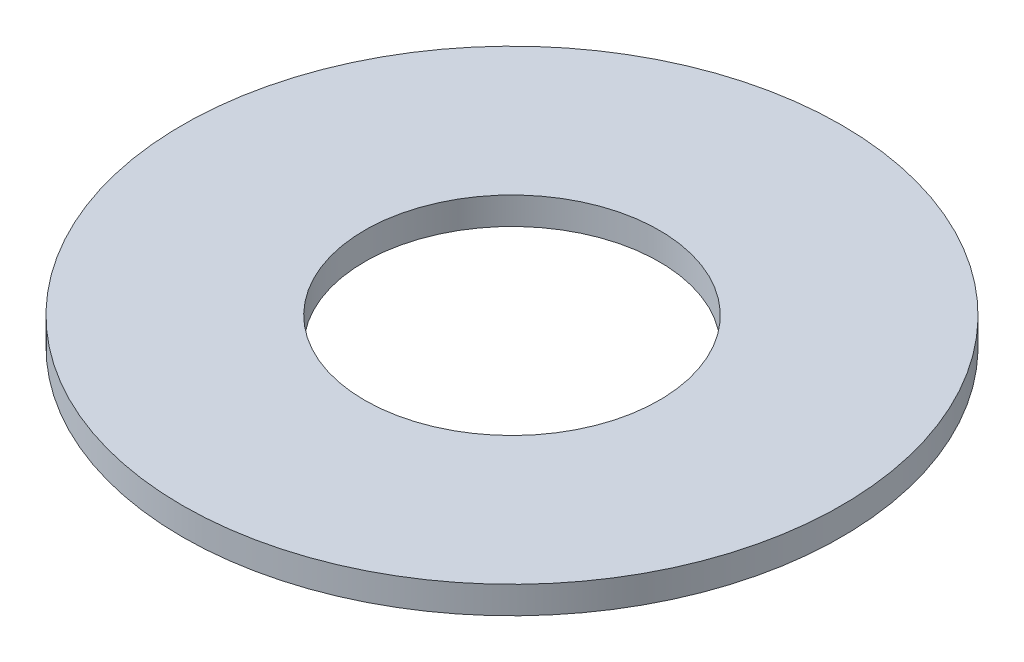
ISO-10303-21;
HEADER;
FILE_DESCRIPTION(('STEP AP214'),'2;1');
FILE_NAME('part.step','',(''),(''),'','','');
FILE_SCHEMA(('AUTOMOTIVE_DESIGN { 1 0 10303 214 1 1 1 1 }'));
ENDSEC;
DATA;
#1=APPLICATION_CONTEXT('core data for automotive mechanical design processes');
#2=APPLICATION_PROTOCOL_DEFINITION('international standard','automotive_design',2000,#1);
#3=PRODUCT_CONTEXT('',#1,'mechanical');
#4=PRODUCT('Part','Part','',(#3));
#5=PRODUCT_RELATED_PRODUCT_CATEGORY('part','',(#4));
#6=PRODUCT_DEFINITION_FORMATION('','',#4);
#7=PRODUCT_DEFINITION_CONTEXT('part definition',#1,'design');
#8=PRODUCT_DEFINITION('design','',#6,#7);
#9=PRODUCT_DEFINITION_SHAPE('','',#8);
#10=(LENGTH_UNIT() NAMED_UNIT(*) SI_UNIT(.MILLI.,.METRE.));
#11=(NAMED_UNIT(*) PLANE_ANGLE_UNIT() SI_UNIT($,.RADIAN.));
#12=(NAMED_UNIT(*) SI_UNIT($,.STERADIAN.) SOLID_ANGLE_UNIT());
#13=UNCERTAINTY_MEASURE_WITH_UNIT(LENGTH_MEASURE(1.E-05),#10,'distance_accuracy_value','');
#14=(GEOMETRIC_REPRESENTATION_CONTEXT(3) GLOBAL_UNCERTAINTY_ASSIGNED_CONTEXT((#13)) GLOBAL_UNIT_ASSIGNED_CONTEXT((#10,
#11,#12)) REPRESENTATION_CONTEXT('',''));
#15=CARTESIAN_POINT('',(0.,0.,0.));
#16=DIRECTION('',(0.,0.,1.));
#17=DIRECTION('',(1.,0.,0.));
#18=AXIS2_PLACEMENT_3D('',#15,#16,#17);
#19=CARTESIAN_POINT('',(0.,2.,0.));
#20=DIRECTION('',(0.,1.,0.));
#21=DIRECTION('',(0.,0.,1.));
#22=AXIS2_PLACEMENT_3D('',#19,#20,#21);
#23=PLANE('',#22);
#24=CARTESIAN_POINT('',(0.,2.,0.));
#25=DIRECTION('',(0.,1.,0.));
#26=DIRECTION('',(0.,0.,1.));
#27=AXIS2_PLACEMENT_3D('',#24,#25,#26);
#28=CIRCLE('',#27,24.15);
#29=CARTESIAN_POINT('',(0.,2.,24.15));
#30=VERTEX_POINT('',#29);
#31=EDGE_CURVE('E10',#30,#30,#28,.T.);
#32=ORIENTED_EDGE('',*,*,#31,.T.);
#33=EDGE_LOOP('',(#32));
#34=FACE_BOUND('',#33,.T.);
#35=CARTESIAN_POINT('',(0.,2.,0.));
#36=DIRECTION('',(0.,1.,0.));
#37=DIRECTION('',(0.,0.,1.));
#38=AXIS2_PLACEMENT_3D('',#35,#36,#37);
#39=CIRCLE('',#38,10.795);
#40=CARTESIAN_POINT('',(0.,2.,10.795));
#41=VERTEX_POINT('',#40);
#42=EDGE_CURVE('E50',#41,#41,#39,.T.);
#43=ORIENTED_EDGE('',*,*,#42,.F.);
#44=EDGE_LOOP('',(#43));
#45=FACE_BOUND('',#44,.T.);
#46=ADVANCED_FACE('F37',(#34,#45),#23,.T.);
#47=CARTESIAN_POINT('',(0.,0.,0.));
#48=DIRECTION('',(0.,1.,0.));
#49=DIRECTION('',(0.,0.,1.));
#50=AXIS2_PLACEMENT_3D('',#47,#48,#49);
#51=PLANE('',#50);
#52=CARTESIAN_POINT('',(0.,0.,0.));
#53=DIRECTION('',(0.,1.,0.));
#54=DIRECTION('',(0.,0.,1.));
#55=AXIS2_PLACEMENT_3D('',#52,#53,#54);
#56=CIRCLE('',#55,24.15);
#57=CARTESIAN_POINT('',(0.,0.,24.15));
#58=VERTEX_POINT('',#57);
#59=EDGE_CURVE('E41',#58,#58,#56,.T.);
#60=ORIENTED_EDGE('',*,*,#59,.F.);
#61=EDGE_LOOP('',(#60));
#62=FACE_BOUND('',#61,.T.);
#63=CARTESIAN_POINT('',(0.,0.,0.));
#64=DIRECTION('',(0.,1.,0.));
#65=DIRECTION('',(0.,0.,1.));
#66=AXIS2_PLACEMENT_3D('',#63,#64,#65);
#67=CIRCLE('',#66,10.795);
#68=CARTESIAN_POINT('',(0.,0.,10.795));
#69=VERTEX_POINT('',#68);
#70=EDGE_CURVE('E52',#69,#69,#67,.T.);
#71=ORIENTED_EDGE('',*,*,#70,.T.);
#72=EDGE_LOOP('',(#71));
#73=FACE_BOUND('',#72,.T.);
#74=ADVANCED_FACE('F64',(#62,#73),#51,.F.);
#75=CARTESIAN_POINT('',(0.,2.,0.));
#76=DIRECTION('',(0.,-1.,0.));
#77=DIRECTION('',(0.,0.,-1.));
#78=AXIS2_PLACEMENT_3D('',#75,#76,#77);
#79=CYLINDRICAL_SURFACE('',#78,24.15);
#80=ORIENTED_EDGE('',*,*,#31,.F.);
#81=EDGE_LOOP('',(#80));
#82=FACE_BOUND('',#81,.T.);
#83=ORIENTED_EDGE('',*,*,#59,.T.);
#84=EDGE_LOOP('',(#83));
#85=FACE_BOUND('',#84,.T.);
#86=ADVANCED_FACE('F39',(#82,#85),#79,.T.);
#87=CARTESIAN_POINT('',(0.,2.,0.));
#88=DIRECTION('',(0.,-1.,0.));
#89=DIRECTION('',(0.,0.,-1.));
#90=AXIS2_PLACEMENT_3D('',#87,#88,#89);
#91=CYLINDRICAL_SURFACE('',#90,10.795);
#92=ORIENTED_EDGE('',*,*,#42,.T.);
#93=EDGE_LOOP('',(#92));
#94=FACE_BOUND('',#93,.T.);
#95=ORIENTED_EDGE('',*,*,#70,.F.);
#96=EDGE_LOOP('',(#95));
#97=FACE_BOUND('',#96,.T.);
#98=ADVANCED_FACE('F60',(#94,#97),#91,.F.);
#99=CLOSED_SHELL('',(#46,#74,#86,#98));
#100=MANIFOLD_SOLID_BREP('B2',#99);
#101=ADVANCED_BREP_SHAPE_REPRESENTATION('',(#18,#100),#14);
#102=SHAPE_DEFINITION_REPRESENTATION(#9,#101);
ENDSEC;
END-ISO-10303-21;
